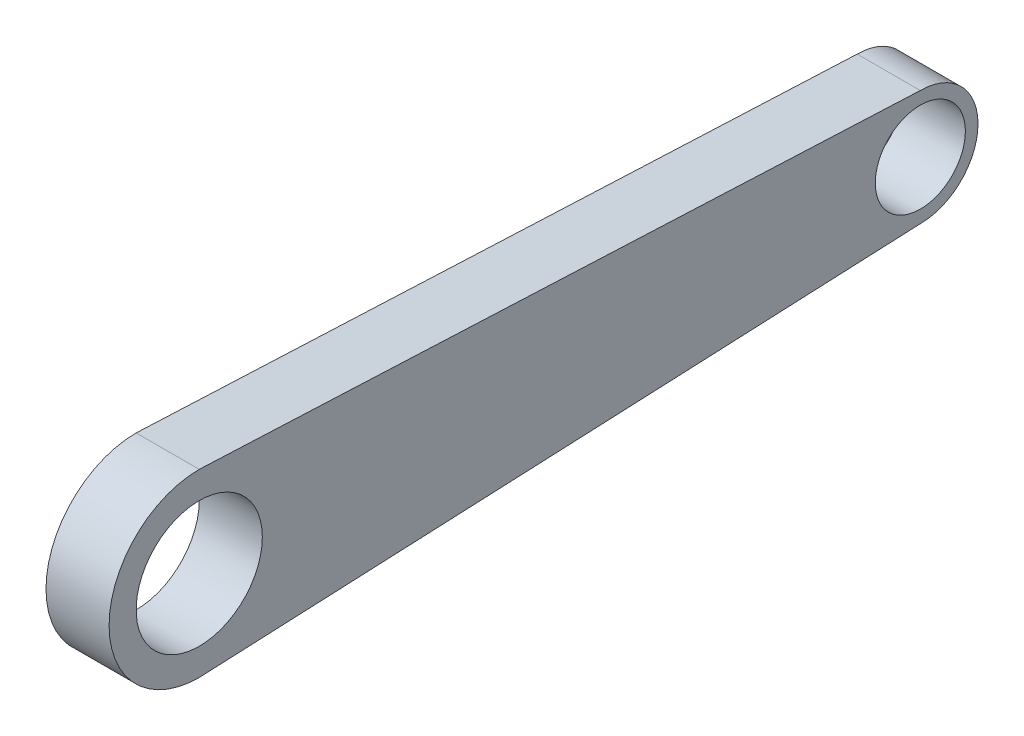
ISO-10303-21;
HEADER;
FILE_DESCRIPTION(('STEP AP214'),'2;1');
FILE_NAME('part.step','',(''),(''),'','','');
FILE_SCHEMA(('AUTOMOTIVE_DESIGN { 1 0 10303 214 1 1 1 1 }'));
ENDSEC;
DATA;
#1=APPLICATION_CONTEXT('core data for automotive mechanical design processes');
#2=APPLICATION_PROTOCOL_DEFINITION('international standard','automotive_design',2000,#1);
#3=PRODUCT_CONTEXT('',#1,'mechanical');
#4=PRODUCT('Part','Part','',(#3));
#5=PRODUCT_RELATED_PRODUCT_CATEGORY('part','',(#4));
#6=PRODUCT_DEFINITION_FORMATION('','',#4);
#7=PRODUCT_DEFINITION_CONTEXT('part definition',#1,'design');
#8=PRODUCT_DEFINITION('design','',#6,#7);
#9=PRODUCT_DEFINITION_SHAPE('','',#8);
#10=(LENGTH_UNIT() NAMED_UNIT(*) SI_UNIT(.MILLI.,.METRE.));
#11=(NAMED_UNIT(*) PLANE_ANGLE_UNIT() SI_UNIT($,.RADIAN.));
#12=(NAMED_UNIT(*) SI_UNIT($,.STERADIAN.) SOLID_ANGLE_UNIT());
#13=UNCERTAINTY_MEASURE_WITH_UNIT(LENGTH_MEASURE(1.E-05),#10,'distance_accuracy_value','');
#14=(GEOMETRIC_REPRESENTATION_CONTEXT(3) GLOBAL_UNCERTAINTY_ASSIGNED_CONTEXT((#13)) GLOBAL_UNIT_ASSIGNED_CONTEXT((#10,
#11,#12)) REPRESENTATION_CONTEXT('',''));
#15=CARTESIAN_POINT('',(0.,0.,0.));
#16=DIRECTION('',(0.,0.,1.));
#17=DIRECTION('',(1.,0.,0.));
#18=AXIS2_PLACEMENT_3D('',#15,#16,#17);
#19=CARTESIAN_POINT('',(3.5,-4.98989546169008,-0.224545295776053));
#20=DIRECTION('',(0.,0.998989035144038,0.0449545065814816));
#21=DIRECTION('',(0.,-0.0449545065814816,0.998989035144038));
#22=AXIS2_PLACEMENT_3D('',#19,#20,#21);
#23=PLANE('',#22);
#24=DIRECTION('',(0.,0.0449545065814816,-0.998989035144038));
#25=VECTOR('',#24,1.);
#26=CARTESIAN_POINT('',(0.,-4.98989546169008,-0.224545295776053));
#27=LINE('',#26,#25);
#28=CARTESIAN_POINT('',(0.,-5.,0.));
#29=VERTEX_POINT('',#28);
#30=CARTESIAN_POINT('',(0.,-3.2,-40.));
#31=VERTEX_POINT('',#30);
#32=EDGE_CURVE('E114',#29,#31,#27,.T.);
#33=ORIENTED_EDGE('',*,*,#32,.T.);
#34=DIRECTION('',(-1.,0.,0.));
#35=VECTOR('',#34,1.);
#36=CARTESIAN_POINT('',(3.5,-3.2,-40.));
#37=LINE('',#36,#35);
#38=CARTESIAN_POINT('',(3.5,-3.2,-40.));
#39=VERTEX_POINT('',#38);
#40=EDGE_CURVE('E11',#39,#31,#37,.T.);
#41=ORIENTED_EDGE('',*,*,#40,.F.);
#42=DIRECTION('',(0.,0.0449545065814816,-0.998989035144038));
#43=VECTOR('',#42,1.);
#44=CARTESIAN_POINT('',(3.5,-4.98989546169008,-0.224545295776053));
#45=LINE('',#44,#43);
#46=CARTESIAN_POINT('',(3.5,-5.,0.));
#47=VERTEX_POINT('',#46);
#48=EDGE_CURVE('E93',#47,#39,#45,.T.);
#49=ORIENTED_EDGE('',*,*,#48,.F.);
#50=DIRECTION('',(-1.,0.,0.));
#51=VECTOR('',#50,1.);
#52=CARTESIAN_POINT('',(3.5,-5.,0.));
#53=LINE('',#52,#51);
#54=EDGE_CURVE('E101',#47,#29,#53,.T.);
#55=ORIENTED_EDGE('',*,*,#54,.T.);
#56=EDGE_LOOP('',(#33,#41,#49,#55));
#57=FACE_BOUND('',#56,.T.);
#58=ADVANCED_FACE('F44',(#57),#23,.F.);
#59=CARTESIAN_POINT('',(3.5,0.,-40.));
#60=DIRECTION('',(-1.,0.,0.));
#61=DIRECTION('',(0.,0.,1.));
#62=AXIS2_PLACEMENT_3D('',#59,#60,#61);
#63=CYLINDRICAL_SURFACE('',#62,3.2);
#64=CARTESIAN_POINT('',(0.,0.,-40.));
#65=DIRECTION('',(1.,0.,0.));
#66=DIRECTION('',(0.,0.,-1.));
#67=AXIS2_PLACEMENT_3D('',#64,#65,#66);
#68=CIRCLE('',#67,3.2);
#69=CARTESIAN_POINT('',(0.,3.2,-40.));
#70=VERTEX_POINT('',#69);
#71=EDGE_CURVE('E97',#31,#70,#68,.T.);
#72=ORIENTED_EDGE('',*,*,#71,.T.);
#73=DIRECTION('',(-1.,0.,0.));
#74=VECTOR('',#73,1.);
#75=CARTESIAN_POINT('',(3.5,3.2,-40.));
#76=LINE('',#75,#74);
#77=CARTESIAN_POINT('',(3.5,3.2,-40.));
#78=VERTEX_POINT('',#77);
#79=EDGE_CURVE('E53',#78,#70,#76,.T.);
#80=ORIENTED_EDGE('',*,*,#79,.F.);
#81=CARTESIAN_POINT('',(3.5,0.,-40.));
#82=DIRECTION('',(1.,0.,0.));
#83=DIRECTION('',(0.,0.,-1.));
#84=AXIS2_PLACEMENT_3D('',#81,#82,#83);
#85=CIRCLE('',#84,3.2);
#86=EDGE_CURVE('E88',#39,#78,#85,.T.);
#87=ORIENTED_EDGE('',*,*,#86,.F.);
#88=ORIENTED_EDGE('',*,*,#40,.T.);
#89=EDGE_LOOP('',(#72,#80,#87,#88));
#90=FACE_BOUND('',#89,.T.);
#91=ADVANCED_FACE('F100',(#90),#63,.T.);
#92=CARTESIAN_POINT('',(3.5,4.98989546169008,-0.224545295776053));
#93=DIRECTION('',(0.,0.998989035144038,-0.0449545065814816));
#94=DIRECTION('',(0.,0.0449545065814816,0.998989035144038));
#95=AXIS2_PLACEMENT_3D('',#92,#93,#94);
#96=PLANE('',#95);
#97=DIRECTION('',(0.,-0.0449545065814816,-0.998989035144038));
#98=VECTOR('',#97,1.);
#99=CARTESIAN_POINT('',(0.,4.98989546169008,-0.224545295776053));
#100=LINE('',#99,#98);
#101=CARTESIAN_POINT('',(0.,5.,0.));
#102=VERTEX_POINT('',#101);
#103=EDGE_CURVE('E116',#102,#70,#100,.T.);
#104=ORIENTED_EDGE('',*,*,#103,.F.);
#105=DIRECTION('',(-1.,0.,0.));
#106=VECTOR('',#105,1.);
#107=CARTESIAN_POINT('',(3.5,5.,0.));
#108=LINE('',#107,#106);
#109=CARTESIAN_POINT('',(3.5,5.,0.));
#110=VERTEX_POINT('',#109);
#111=EDGE_CURVE('E76',#110,#102,#108,.T.);
#112=ORIENTED_EDGE('',*,*,#111,.F.);
#113=DIRECTION('',(0.,-0.0449545065814816,-0.998989035144038));
#114=VECTOR('',#113,1.);
#115=CARTESIAN_POINT('',(3.5,4.98989546169008,-0.224545295776053));
#116=LINE('',#115,#114);
#117=EDGE_CURVE('E91',#110,#78,#116,.T.);
#118=ORIENTED_EDGE('',*,*,#117,.T.);
#119=ORIENTED_EDGE('',*,*,#79,.T.);
#120=EDGE_LOOP('',(#104,#112,#118,#119));
#121=FACE_BOUND('',#120,.T.);
#122=ADVANCED_FACE('F105',(#121),#96,.T.);
#123=CARTESIAN_POINT('',(3.5,0.,-40.));
#124=DIRECTION('',(-1.,0.,0.));
#125=DIRECTION('',(0.,0.,1.));
#126=AXIS2_PLACEMENT_3D('',#123,#124,#125);
#127=CYLINDRICAL_SURFACE('',#126,2.5);
#128=CARTESIAN_POINT('',(3.5,0.,-40.));
#129=DIRECTION('',(1.,0.,0.));
#130=DIRECTION('',(0.,0.,-1.));
#131=AXIS2_PLACEMENT_3D('',#128,#129,#130);
#132=CIRCLE('',#131,2.5);
#133=CARTESIAN_POINT('',(3.5,0.,-42.5));
#134=VERTEX_POINT('',#133);
#135=EDGE_CURVE('E157',#134,#134,#132,.T.);
#136=ORIENTED_EDGE('',*,*,#135,.T.);
#137=EDGE_LOOP('',(#136));
#138=FACE_BOUND('',#137,.T.);
#139=CARTESIAN_POINT('',(0.,0.,-40.));
#140=DIRECTION('',(1.,0.,0.));
#141=DIRECTION('',(0.,0.,-1.));
#142=AXIS2_PLACEMENT_3D('',#139,#140,#141);
#143=CIRCLE('',#142,2.5);
#144=CARTESIAN_POINT('',(0.,0.,-42.5));
#145=VERTEX_POINT('',#144);
#146=EDGE_CURVE('E112',#145,#145,#143,.T.);
#147=ORIENTED_EDGE('',*,*,#146,.F.);
#148=EDGE_LOOP('',(#147));
#149=FACE_BOUND('',#148,.T.);
#150=ADVANCED_FACE('F144',(#138,#149),#127,.F.);
#151=CARTESIAN_POINT('',(3.5,0.,0.));
#152=DIRECTION('',(-1.,0.,0.));
#153=DIRECTION('',(0.,0.,1.));
#154=AXIS2_PLACEMENT_3D('',#151,#152,#153);
#155=CYLINDRICAL_SURFACE('',#154,3.5);
#156=CARTESIAN_POINT('',(3.5,0.,0.));
#157=DIRECTION('',(1.,0.,0.));
#158=DIRECTION('',(0.,0.,-1.));
#159=AXIS2_PLACEMENT_3D('',#156,#157,#158);
#160=CIRCLE('',#159,3.5);
#161=CARTESIAN_POINT('',(3.5,0.,-3.5));
#162=VERTEX_POINT('',#161);
#163=EDGE_CURVE('E123',#162,#162,#160,.T.);
#164=ORIENTED_EDGE('',*,*,#163,.T.);
#165=EDGE_LOOP('',(#164));
#166=FACE_BOUND('',#165,.T.);
#167=CARTESIAN_POINT('',(0.,0.,0.));
#168=DIRECTION('',(1.,0.,0.));
#169=DIRECTION('',(0.,0.,-1.));
#170=AXIS2_PLACEMENT_3D('',#167,#168,#169);
#171=CIRCLE('',#170,3.5);
#172=CARTESIAN_POINT('',(0.,0.,-3.5));
#173=VERTEX_POINT('',#172);
#174=EDGE_CURVE('E106',#173,#173,#171,.T.);
#175=ORIENTED_EDGE('',*,*,#174,.F.);
#176=EDGE_LOOP('',(#175));
#177=FACE_BOUND('',#176,.T.);
#178=ADVANCED_FACE('F50',(#166,#177),#155,.F.);
#179=CARTESIAN_POINT('',(3.5,0.,0.));
#180=DIRECTION('',(-1.,0.,0.));
#181=DIRECTION('',(0.,0.,1.));
#182=AXIS2_PLACEMENT_3D('',#179,#180,#181);
#183=CYLINDRICAL_SURFACE('',#182,5.);
#184=CARTESIAN_POINT('',(0.,0.,0.));
#185=DIRECTION('',(1.,0.,0.));
#186=DIRECTION('',(0.,0.,-1.));
#187=AXIS2_PLACEMENT_3D('',#184,#185,#186);
#188=CIRCLE('',#187,5.);
#189=EDGE_CURVE('E83',#102,#29,#188,.T.);
#190=ORIENTED_EDGE('',*,*,#189,.T.);
#191=ORIENTED_EDGE('',*,*,#54,.F.);
#192=CARTESIAN_POINT('',(3.5,0.,0.));
#193=DIRECTION('',(1.,0.,0.));
#194=DIRECTION('',(0.,0.,-1.));
#195=AXIS2_PLACEMENT_3D('',#192,#193,#194);
#196=CIRCLE('',#195,5.);
#197=EDGE_CURVE('E65',#110,#47,#196,.T.);
#198=ORIENTED_EDGE('',*,*,#197,.F.);
#199=ORIENTED_EDGE('',*,*,#111,.T.);
#200=EDGE_LOOP('',(#190,#191,#198,#199));
#201=FACE_BOUND('',#200,.T.);
#202=ADVANCED_FACE('F133',(#201),#183,.T.);
#203=CARTESIAN_POINT('',(3.5,0.,0.));
#204=DIRECTION('',(1.,0.,0.));
#205=DIRECTION('',(0.,0.,-1.));
#206=AXIS2_PLACEMENT_3D('',#203,#204,#205);
#207=PLANE('',#206);
#208=ORIENTED_EDGE('',*,*,#163,.F.);
#209=EDGE_LOOP('',(#208));
#210=FACE_BOUND('',#209,.T.);
#211=ORIENTED_EDGE('',*,*,#135,.F.);
#212=EDGE_LOOP('',(#211));
#213=FACE_BOUND('',#212,.T.);
#214=ORIENTED_EDGE('',*,*,#48,.T.);
#215=ORIENTED_EDGE('',*,*,#86,.T.);
#216=ORIENTED_EDGE('',*,*,#117,.F.);
#217=ORIENTED_EDGE('',*,*,#197,.T.);
#218=EDGE_LOOP('',(#214,#215,#216,#217));
#219=FACE_BOUND('',#218,.T.);
#220=ADVANCED_FACE('F87',(#210,#213,#219),#207,.T.);
#221=CARTESIAN_POINT('',(0.,0.,0.));
#222=DIRECTION('',(1.,0.,0.));
#223=DIRECTION('',(0.,0.,-1.));
#224=AXIS2_PLACEMENT_3D('',#221,#222,#223);
#225=PLANE('',#224);
#226=ORIENTED_EDGE('',*,*,#174,.T.);
#227=EDGE_LOOP('',(#226));
#228=FACE_BOUND('',#227,.T.);
#229=ORIENTED_EDGE('',*,*,#146,.T.);
#230=EDGE_LOOP('',(#229));
#231=FACE_BOUND('',#230,.T.);
#232=ORIENTED_EDGE('',*,*,#32,.F.);
#233=ORIENTED_EDGE('',*,*,#189,.F.);
#234=ORIENTED_EDGE('',*,*,#103,.T.);
#235=ORIENTED_EDGE('',*,*,#71,.F.);
#236=EDGE_LOOP('',(#232,#233,#234,#235));
#237=FACE_BOUND('',#236,.T.);
#238=ADVANCED_FACE('F128',(#228,#231,#237),#225,.F.);
#239=CLOSED_SHELL('',(#58,#91,#122,#150,#178,#202,#220,#238));
#240=MANIFOLD_SOLID_BREP('B2',#239);
#241=ADVANCED_BREP_SHAPE_REPRESENTATION('',(#18,#240),#14);
#242=SHAPE_DEFINITION_REPRESENTATION(#9,#241);
ENDSEC;
END-ISO-10303-21;
